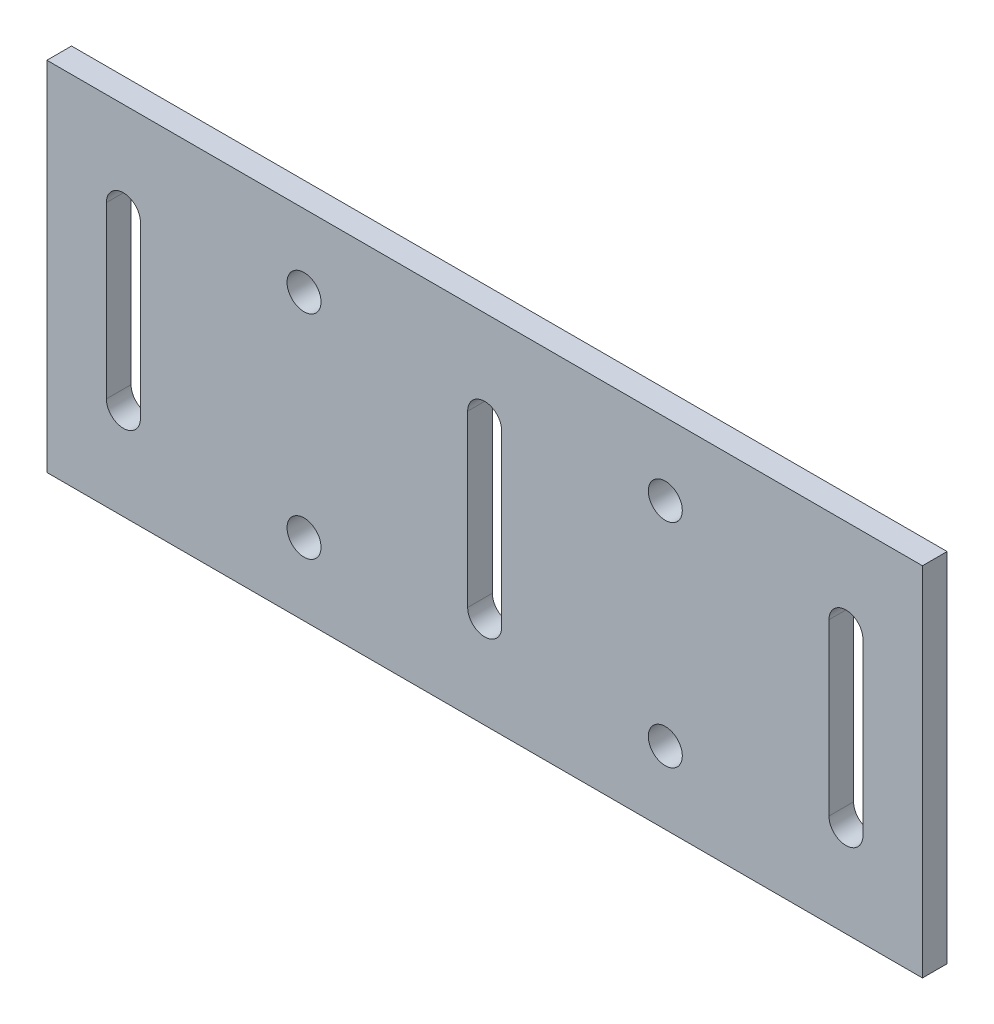
ISO-10303-21;
HEADER;
FILE_DESCRIPTION(('STEP AP214'),'2;1');
FILE_NAME('part.step','',(''),(''),'','','');
FILE_SCHEMA(('AUTOMOTIVE_DESIGN { 1 0 10303 214 1 1 1 1 }'));
ENDSEC;
DATA;
#1=APPLICATION_CONTEXT('core data for automotive mechanical design processes');
#2=APPLICATION_PROTOCOL_DEFINITION('international standard','automotive_design',2000,#1);
#3=PRODUCT_CONTEXT('',#1,'mechanical');
#4=PRODUCT('Part','Part','',(#3));
#5=PRODUCT_RELATED_PRODUCT_CATEGORY('part','',(#4));
#6=PRODUCT_DEFINITION_FORMATION('','',#4);
#7=PRODUCT_DEFINITION_CONTEXT('part definition',#1,'design');
#8=PRODUCT_DEFINITION('design','',#6,#7);
#9=PRODUCT_DEFINITION_SHAPE('','',#8);
#10=(LENGTH_UNIT() NAMED_UNIT(*) SI_UNIT(.MILLI.,.METRE.));
#11=(NAMED_UNIT(*) PLANE_ANGLE_UNIT() SI_UNIT($,.RADIAN.));
#12=(NAMED_UNIT(*) SI_UNIT($,.STERADIAN.) SOLID_ANGLE_UNIT());
#13=UNCERTAINTY_MEASURE_WITH_UNIT(LENGTH_MEASURE(1.E-05),#10,'distance_accuracy_value','');
#14=(GEOMETRIC_REPRESENTATION_CONTEXT(3) GLOBAL_UNCERTAINTY_ASSIGNED_CONTEXT((#13)) GLOBAL_UNIT_ASSIGNED_CONTEXT((#10,
#11,#12)) REPRESENTATION_CONTEXT('',''));
#15=CARTESIAN_POINT('',(0.,0.,0.));
#16=DIRECTION('',(0.,0.,1.));
#17=DIRECTION('',(1.,0.,0.));
#18=AXIS2_PLACEMENT_3D('',#15,#16,#17);
#19=CARTESIAN_POINT('',(0.,0.,5.8));
#20=DIRECTION('',(0.,0.,-1.));
#21=DIRECTION('',(-1.,0.,0.));
#22=AXIS2_PLACEMENT_3D('',#19,#20,#21);
#23=PLANE('',#22);
#24=CARTESIAN_POINT('',(60.5,17.,5.8));
#25=DIRECTION('',(0.,0.,1.));
#26=DIRECTION('',(1.,0.,0.));
#27=AXIS2_PLACEMENT_3D('',#24,#25,#26);
#28=CIRCLE('',#27,4.00000000000001);
#29=CARTESIAN_POINT('',(64.5,17.,5.8));
#30=VERTEX_POINT('',#29);
#31=EDGE_CURVE('E394',#30,#30,#28,.T.);
#32=ORIENTED_EDGE('',*,*,#31,.F.);
#33=EDGE_LOOP('',(#32));
#34=FACE_BOUND('',#33,.T.);
#35=CARTESIAN_POINT('',(145.5,17.,5.8));
#36=DIRECTION('',(0.,0.,1.));
#37=DIRECTION('',(1.,0.,0.));
#38=AXIS2_PLACEMENT_3D('',#35,#36,#37);
#39=CIRCLE('',#38,3.99999999999999);
#40=CARTESIAN_POINT('',(149.5,17.,5.8));
#41=VERTEX_POINT('',#40);
#42=EDGE_CURVE('E398',#41,#41,#39,.T.);
#43=ORIENTED_EDGE('',*,*,#42,.F.);
#44=EDGE_LOOP('',(#43));
#45=FACE_BOUND('',#44,.T.);
#46=CARTESIAN_POINT('',(145.5,67.,5.8));
#47=DIRECTION('',(0.,0.,1.));
#48=DIRECTION('',(1.,0.,0.));
#49=AXIS2_PLACEMENT_3D('',#46,#47,#48);
#50=CIRCLE('',#49,3.99999999999999);
#51=CARTESIAN_POINT('',(149.5,67.,5.8));
#52=VERTEX_POINT('',#51);
#53=EDGE_CURVE('E406',#52,#52,#50,.T.);
#54=ORIENTED_EDGE('',*,*,#53,.F.);
#55=EDGE_LOOP('',(#54));
#56=FACE_BOUND('',#55,.T.);
#57=CARTESIAN_POINT('',(60.5,67.,5.8));
#58=DIRECTION('',(0.,0.,1.));
#59=DIRECTION('',(1.,0.,0.));
#60=AXIS2_PLACEMENT_3D('',#57,#58,#59);
#61=CIRCLE('',#60,4.00000000000001);
#62=CARTESIAN_POINT('',(64.5,67.,5.8));
#63=VERTEX_POINT('',#62);
#64=EDGE_CURVE('E176',#63,#63,#61,.T.);
#65=ORIENTED_EDGE('',*,*,#64,.F.);
#66=EDGE_LOOP('',(#65));
#67=FACE_BOUND('',#66,.T.);
#68=CARTESIAN_POINT('',(103.,62.,5.8));
#69=DIRECTION('',(0.,0.,1.));
#70=DIRECTION('',(1.,0.,0.));
#71=AXIS2_PLACEMENT_3D('',#68,#69,#70);
#72=CIRCLE('',#71,3.99999999999996);
#73=CARTESIAN_POINT('',(107.,62.,5.8));
#74=VERTEX_POINT('',#73);
#75=CARTESIAN_POINT('',(99.,62.,5.8));
#76=VERTEX_POINT('',#75);
#77=EDGE_CURVE('E186',#74,#76,#72,.T.);
#78=ORIENTED_EDGE('',*,*,#77,.F.);
#79=DIRECTION('',(0.,1.,0.));
#80=VECTOR('',#79,1.);
#81=CARTESIAN_POINT('',(107.,62.,5.8));
#82=LINE('',#81,#80);
#83=CARTESIAN_POINT('',(107.,22.,5.8));
#84=VERTEX_POINT('',#83);
#85=EDGE_CURVE('E194',#84,#74,#82,.T.);
#86=ORIENTED_EDGE('',*,*,#85,.F.);
#87=CARTESIAN_POINT('',(103.,22.,5.8));
#88=DIRECTION('',(0.,0.,1.));
#89=DIRECTION('',(1.,0.,0.));
#90=AXIS2_PLACEMENT_3D('',#87,#88,#89);
#91=CIRCLE('',#90,3.99999999999996);
#92=CARTESIAN_POINT('',(99.0000000000001,22.,5.8));
#93=VERTEX_POINT('',#92);
#94=EDGE_CURVE('E191',#93,#84,#91,.T.);
#95=ORIENTED_EDGE('',*,*,#94,.F.);
#96=DIRECTION('',(0.,-1.,0.));
#97=VECTOR('',#96,1.);
#98=CARTESIAN_POINT('',(99.,62.,5.8));
#99=LINE('',#98,#97);
#100=EDGE_CURVE('E188',#76,#93,#99,.T.);
#101=ORIENTED_EDGE('',*,*,#100,.F.);
#102=EDGE_LOOP('',(#78,#86,#95,#101));
#103=FACE_BOUND('',#102,.T.);
#104=DIRECTION('',(0.,-1.,0.));
#105=VECTOR('',#104,1.);
#106=CARTESIAN_POINT('',(0.,0.,5.8));
#107=LINE('',#106,#105);
#108=CARTESIAN_POINT('',(0.,84.,5.8));
#109=VERTEX_POINT('',#108);
#110=CARTESIAN_POINT('',(0.,0.,5.8));
#111=VERTEX_POINT('',#110);
#112=EDGE_CURVE('E248',#109,#111,#107,.T.);
#113=ORIENTED_EDGE('',*,*,#112,.T.);
#114=DIRECTION('',(1.,0.,0.));
#115=VECTOR('',#114,1.);
#116=CARTESIAN_POINT('',(0.,0.,5.8));
#117=LINE('',#116,#115);
#118=CARTESIAN_POINT('',(206.,0.,5.8));
#119=VERTEX_POINT('',#118);
#120=EDGE_CURVE('E251',#111,#119,#117,.T.);
#121=ORIENTED_EDGE('',*,*,#120,.T.);
#122=DIRECTION('',(0.,1.,0.));
#123=VECTOR('',#122,1.);
#124=CARTESIAN_POINT('',(206.,0.,5.8));
#125=LINE('',#124,#123);
#126=CARTESIAN_POINT('',(206.,84.,5.8));
#127=VERTEX_POINT('',#126);
#128=EDGE_CURVE('E254',#119,#127,#125,.T.);
#129=ORIENTED_EDGE('',*,*,#128,.T.);
#130=DIRECTION('',(-1.,0.,0.));
#131=VECTOR('',#130,1.);
#132=CARTESIAN_POINT('',(0.,84.,5.8));
#133=LINE('',#132,#131);
#134=EDGE_CURVE('E256',#127,#109,#133,.T.);
#135=ORIENTED_EDGE('',*,*,#134,.T.);
#136=EDGE_LOOP('',(#113,#121,#129,#135));
#137=FACE_BOUND('',#136,.T.);
#138=CARTESIAN_POINT('',(18.,62.,5.8));
#139=DIRECTION('',(0.,0.,1.));
#140=DIRECTION('',(1.,0.,0.));
#141=AXIS2_PLACEMENT_3D('',#138,#139,#140);
#142=CIRCLE('',#141,4.00000000000001);
#143=CARTESIAN_POINT('',(22.,62.,5.8));
#144=VERTEX_POINT('',#143);
#145=CARTESIAN_POINT('',(14.,62.,5.8));
#146=VERTEX_POINT('',#145);
#147=EDGE_CURVE('E217',#144,#146,#142,.T.);
#148=ORIENTED_EDGE('',*,*,#147,.F.);
#149=DIRECTION('',(0.,1.,0.));
#150=VECTOR('',#149,1.);
#151=CARTESIAN_POINT('',(22.,62.,5.8));
#152=LINE('',#151,#150);
#153=CARTESIAN_POINT('',(22.,22.,5.8));
#154=VERTEX_POINT('',#153);
#155=EDGE_CURVE('E225',#154,#144,#152,.T.);
#156=ORIENTED_EDGE('',*,*,#155,.F.);
#157=CARTESIAN_POINT('',(18.,22.,5.8));
#158=DIRECTION('',(0.,0.,1.));
#159=DIRECTION('',(1.,0.,0.));
#160=AXIS2_PLACEMENT_3D('',#157,#158,#159);
#161=CIRCLE('',#160,4.00000000000001);
#162=CARTESIAN_POINT('',(14.,22.,5.8));
#163=VERTEX_POINT('',#162);
#164=EDGE_CURVE('E222',#163,#154,#161,.T.);
#165=ORIENTED_EDGE('',*,*,#164,.F.);
#166=DIRECTION('',(0.,-1.,0.));
#167=VECTOR('',#166,1.);
#168=CARTESIAN_POINT('',(14.,62.,5.8));
#169=LINE('',#168,#167);
#170=EDGE_CURVE('E219',#146,#163,#169,.T.);
#171=ORIENTED_EDGE('',*,*,#170,.F.);
#172=EDGE_LOOP('',(#148,#156,#165,#171));
#173=FACE_BOUND('',#172,.T.);
#174=CARTESIAN_POINT('',(188.,62.,5.8));
#175=DIRECTION('',(0.,0.,1.));
#176=DIRECTION('',(1.,0.,0.));
#177=AXIS2_PLACEMENT_3D('',#174,#175,#176);
#178=CIRCLE('',#177,4.);
#179=CARTESIAN_POINT('',(192.,62.,5.8));
#180=VERTEX_POINT('',#179);
#181=CARTESIAN_POINT('',(184.,62.,5.8));
#182=VERTEX_POINT('',#181);
#183=EDGE_CURVE('E148',#180,#182,#178,.T.);
#184=ORIENTED_EDGE('',*,*,#183,.F.);
#185=DIRECTION('',(0.,1.,0.));
#186=VECTOR('',#185,1.);
#187=CARTESIAN_POINT('',(192.,62.,5.8));
#188=LINE('',#187,#186);
#189=CARTESIAN_POINT('',(192.,22.,5.8));
#190=VERTEX_POINT('',#189);
#191=EDGE_CURVE('E170',#190,#180,#188,.T.);
#192=ORIENTED_EDGE('',*,*,#191,.F.);
#193=CARTESIAN_POINT('',(188.,22.,5.8));
#194=DIRECTION('',(0.,0.,1.));
#195=DIRECTION('',(1.,0.,0.));
#196=AXIS2_PLACEMENT_3D('',#193,#194,#195);
#197=CIRCLE('',#196,4.);
#198=CARTESIAN_POINT('',(184.,22.,5.8));
#199=VERTEX_POINT('',#198);
#200=EDGE_CURVE('E168',#199,#190,#197,.T.);
#201=ORIENTED_EDGE('',*,*,#200,.F.);
#202=DIRECTION('',(0.,-1.,0.));
#203=VECTOR('',#202,1.);
#204=CARTESIAN_POINT('',(184.,62.,5.8));
#205=LINE('',#204,#203);
#206=EDGE_CURVE('E156',#182,#199,#205,.T.);
#207=ORIENTED_EDGE('',*,*,#206,.F.);
#208=EDGE_LOOP('',(#184,#192,#201,#207));
#209=FACE_BOUND('',#208,.T.);
#210=ADVANCED_FACE('F35',(#34,#45,#56,#67,#103,#137,#173,#209),#23,.F.);
#211=CARTESIAN_POINT('',(0.,0.,0.));
#212=DIRECTION('',(0.,0.,-1.));
#213=DIRECTION('',(-1.,0.,0.));
#214=AXIS2_PLACEMENT_3D('',#211,#212,#213);
#215=PLANE('',#214);
#216=CARTESIAN_POINT('',(60.5,17.,0.));
#217=DIRECTION('',(0.,0.,-1.));
#218=DIRECTION('',(-1.,0.,0.));
#219=AXIS2_PLACEMENT_3D('',#216,#217,#218);
#220=CIRCLE('',#219,4.00000000000001);
#221=CARTESIAN_POINT('',(64.5,17.,0.));
#222=VERTEX_POINT('',#221);
#223=EDGE_CURVE('E392',#222,#222,#220,.F.);
#224=ORIENTED_EDGE('',*,*,#223,.T.);
#225=EDGE_LOOP('',(#224));
#226=FACE_BOUND('',#225,.T.);
#227=CARTESIAN_POINT('',(145.5,17.,0.));
#228=DIRECTION('',(0.,0.,-1.));
#229=DIRECTION('',(-1.,0.,0.));
#230=AXIS2_PLACEMENT_3D('',#227,#228,#229);
#231=CIRCLE('',#230,3.99999999999999);
#232=CARTESIAN_POINT('',(149.5,17.,0.));
#233=VERTEX_POINT('',#232);
#234=EDGE_CURVE('E403',#233,#233,#231,.F.);
#235=ORIENTED_EDGE('',*,*,#234,.T.);
#236=EDGE_LOOP('',(#235));
#237=FACE_BOUND('',#236,.T.);
#238=CARTESIAN_POINT('',(145.5,67.,0.));
#239=DIRECTION('',(0.,0.,-1.));
#240=DIRECTION('',(-1.,0.,0.));
#241=AXIS2_PLACEMENT_3D('',#238,#239,#240);
#242=CIRCLE('',#241,3.99999999999999);
#243=CARTESIAN_POINT('',(149.5,67.,0.));
#244=VERTEX_POINT('',#243);
#245=EDGE_CURVE('E409',#244,#244,#242,.F.);
#246=ORIENTED_EDGE('',*,*,#245,.T.);
#247=EDGE_LOOP('',(#246));
#248=FACE_BOUND('',#247,.T.);
#249=CARTESIAN_POINT('',(60.5,67.,0.));
#250=DIRECTION('',(0.,0.,-1.));
#251=DIRECTION('',(-1.,0.,0.));
#252=AXIS2_PLACEMENT_3D('',#249,#250,#251);
#253=CIRCLE('',#252,4.00000000000001);
#254=CARTESIAN_POINT('',(64.5,67.,0.));
#255=VERTEX_POINT('',#254);
#256=EDGE_CURVE('E395',#255,#255,#253,.F.);
#257=ORIENTED_EDGE('',*,*,#256,.T.);
#258=EDGE_LOOP('',(#257));
#259=FACE_BOUND('',#258,.T.);
#260=DIRECTION('',(0.,-1.,0.));
#261=VECTOR('',#260,1.);
#262=CARTESIAN_POINT('',(0.,0.,0.));
#263=LINE('',#262,#261);
#264=CARTESIAN_POINT('',(0.,84.,0.));
#265=VERTEX_POINT('',#264);
#266=CARTESIAN_POINT('',(0.,0.,0.));
#267=VERTEX_POINT('',#266);
#268=EDGE_CURVE('E247',#265,#267,#263,.T.);
#269=ORIENTED_EDGE('',*,*,#268,.F.);
#270=DIRECTION('',(-1.,0.,0.));
#271=VECTOR('',#270,1.);
#272=CARTESIAN_POINT('',(0.,84.,0.));
#273=LINE('',#272,#271);
#274=CARTESIAN_POINT('',(206.,84.,0.));
#275=VERTEX_POINT('',#274);
#276=EDGE_CURVE('E252',#275,#265,#273,.T.);
#277=ORIENTED_EDGE('',*,*,#276,.F.);
#278=DIRECTION('',(0.,1.,0.));
#279=VECTOR('',#278,1.);
#280=CARTESIAN_POINT('',(206.,0.,0.));
#281=LINE('',#280,#279);
#282=CARTESIAN_POINT('',(206.,0.,0.));
#283=VERTEX_POINT('',#282);
#284=EDGE_CURVE('E263',#283,#275,#281,.T.);
#285=ORIENTED_EDGE('',*,*,#284,.F.);
#286=DIRECTION('',(1.,0.,0.));
#287=VECTOR('',#286,1.);
#288=CARTESIAN_POINT('',(0.,0.,0.));
#289=LINE('',#288,#287);
#290=EDGE_CURVE('E261',#267,#283,#289,.T.);
#291=ORIENTED_EDGE('',*,*,#290,.F.);
#292=EDGE_LOOP('',(#269,#277,#285,#291));
#293=FACE_BOUND('',#292,.T.);
#294=DIRECTION('',(0.,1.,0.));
#295=VECTOR('',#294,1.);
#296=CARTESIAN_POINT('',(22.,62.,0.));
#297=LINE('',#296,#295);
#298=CARTESIAN_POINT('',(22.,22.,0.));
#299=VERTEX_POINT('',#298);
#300=CARTESIAN_POINT('',(22.,62.,0.));
#301=VERTEX_POINT('',#300);
#302=EDGE_CURVE('E220',#299,#301,#297,.T.);
#303=ORIENTED_EDGE('',*,*,#302,.T.);
#304=CARTESIAN_POINT('',(18.,62.,0.));
#305=DIRECTION('',(0.,0.,1.));
#306=DIRECTION('',(1.,0.,0.));
#307=AXIS2_PLACEMENT_3D('',#304,#305,#306);
#308=CIRCLE('',#307,4.00000000000001);
#309=CARTESIAN_POINT('',(14.,62.,0.));
#310=VERTEX_POINT('',#309);
#311=EDGE_CURVE('E216',#301,#310,#308,.T.);
#312=ORIENTED_EDGE('',*,*,#311,.T.);
#313=DIRECTION('',(0.,-1.,0.));
#314=VECTOR('',#313,1.);
#315=CARTESIAN_POINT('',(14.,62.,0.));
#316=LINE('',#315,#314);
#317=CARTESIAN_POINT('',(14.,22.,0.));
#318=VERTEX_POINT('',#317);
#319=EDGE_CURVE('E230',#310,#318,#316,.T.);
#320=ORIENTED_EDGE('',*,*,#319,.T.);
#321=CARTESIAN_POINT('',(18.,22.,0.));
#322=DIRECTION('',(0.,0.,1.));
#323=DIRECTION('',(1.,0.,0.));
#324=AXIS2_PLACEMENT_3D('',#321,#322,#323);
#325=CIRCLE('',#324,4.00000000000001);
#326=EDGE_CURVE('E233',#318,#299,#325,.T.);
#327=ORIENTED_EDGE('',*,*,#326,.T.);
#328=EDGE_LOOP('',(#303,#312,#320,#327));
#329=FACE_BOUND('',#328,.T.);
#330=DIRECTION('',(0.,1.,0.));
#331=VECTOR('',#330,1.);
#332=CARTESIAN_POINT('',(107.,62.,0.));
#333=LINE('',#332,#331);
#334=CARTESIAN_POINT('',(107.,22.,0.));
#335=VERTEX_POINT('',#334);
#336=CARTESIAN_POINT('',(107.,62.,0.));
#337=VERTEX_POINT('',#336);
#338=EDGE_CURVE('E189',#335,#337,#333,.T.);
#339=ORIENTED_EDGE('',*,*,#338,.T.);
#340=CARTESIAN_POINT('',(103.,62.,0.));
#341=DIRECTION('',(0.,0.,1.));
#342=DIRECTION('',(1.,0.,0.));
#343=AXIS2_PLACEMENT_3D('',#340,#341,#342);
#344=CIRCLE('',#343,3.99999999999996);
#345=CARTESIAN_POINT('',(99.,62.,0.));
#346=VERTEX_POINT('',#345);
#347=EDGE_CURVE('E164',#337,#346,#344,.T.);
#348=ORIENTED_EDGE('',*,*,#347,.T.);
#349=DIRECTION('',(0.,-1.,0.));
#350=VECTOR('',#349,1.);
#351=CARTESIAN_POINT('',(99.,62.,0.));
#352=LINE('',#351,#350);
#353=CARTESIAN_POINT('',(99.0000000000001,22.,0.));
#354=VERTEX_POINT('',#353);
#355=EDGE_CURVE('E199',#346,#354,#352,.T.);
#356=ORIENTED_EDGE('',*,*,#355,.T.);
#357=CARTESIAN_POINT('',(103.,22.,0.));
#358=DIRECTION('',(0.,0.,1.));
#359=DIRECTION('',(1.,0.,0.));
#360=AXIS2_PLACEMENT_3D('',#357,#358,#359);
#361=CIRCLE('',#360,3.99999999999996);
#362=EDGE_CURVE('E202',#354,#335,#361,.T.);
#363=ORIENTED_EDGE('',*,*,#362,.T.);
#364=EDGE_LOOP('',(#339,#348,#356,#363));
#365=FACE_BOUND('',#364,.T.);
#366=DIRECTION('',(0.,1.,0.));
#367=VECTOR('',#366,1.);
#368=CARTESIAN_POINT('',(192.,62.,0.));
#369=LINE('',#368,#367);
#370=CARTESIAN_POINT('',(192.,22.,0.));
#371=VERTEX_POINT('',#370);
#372=CARTESIAN_POINT('',(192.,62.,0.));
#373=VERTEX_POINT('',#372);
#374=EDGE_CURVE('E157',#371,#373,#369,.T.);
#375=ORIENTED_EDGE('',*,*,#374,.T.);
#376=CARTESIAN_POINT('',(188.,62.,0.));
#377=DIRECTION('',(0.,0.,1.));
#378=DIRECTION('',(1.,0.,0.));
#379=AXIS2_PLACEMENT_3D('',#376,#377,#378);
#380=CIRCLE('',#379,4.);
#381=CARTESIAN_POINT('',(184.,62.,0.));
#382=VERTEX_POINT('',#381);
#383=EDGE_CURVE('E58',#373,#382,#380,.T.);
#384=ORIENTED_EDGE('',*,*,#383,.T.);
#385=DIRECTION('',(0.,-1.,0.));
#386=VECTOR('',#385,1.);
#387=CARTESIAN_POINT('',(184.,62.,0.));
#388=LINE('',#387,#386);
#389=CARTESIAN_POINT('',(184.,22.,0.));
#390=VERTEX_POINT('',#389);
#391=EDGE_CURVE('E163',#382,#390,#388,.T.);
#392=ORIENTED_EDGE('',*,*,#391,.T.);
#393=CARTESIAN_POINT('',(188.,22.,0.));
#394=DIRECTION('',(0.,0.,1.));
#395=DIRECTION('',(1.,0.,0.));
#396=AXIS2_PLACEMENT_3D('',#393,#394,#395);
#397=CIRCLE('',#396,4.);
#398=EDGE_CURVE('E178',#390,#371,#397,.T.);
#399=ORIENTED_EDGE('',*,*,#398,.T.);
#400=EDGE_LOOP('',(#375,#384,#392,#399));
#401=FACE_BOUND('',#400,.T.);
#402=ADVANCED_FACE('F281',(#226,#237,#248,#259,#293,#329,#365,#401),#215,.T.);
#403=CARTESIAN_POINT('',(0.,0.,5.8));
#404=DIRECTION('',(1.,0.,0.));
#405=DIRECTION('',(0.,0.,-1.));
#406=AXIS2_PLACEMENT_3D('',#403,#404,#405);
#407=PLANE('',#406);
#408=ORIENTED_EDGE('',*,*,#268,.T.);
#409=DIRECTION('',(0.,0.,-1.));
#410=VECTOR('',#409,1.);
#411=CARTESIAN_POINT('',(0.,0.,5.8));
#412=LINE('',#411,#410);
#413=EDGE_CURVE('E11',#111,#267,#412,.T.);
#414=ORIENTED_EDGE('',*,*,#413,.F.);
#415=ORIENTED_EDGE('',*,*,#112,.F.);
#416=DIRECTION('',(0.,0.,-1.));
#417=VECTOR('',#416,1.);
#418=CARTESIAN_POINT('',(0.,84.,5.8));
#419=LINE('',#418,#417);
#420=EDGE_CURVE('E258',#109,#265,#419,.T.);
#421=ORIENTED_EDGE('',*,*,#420,.T.);
#422=EDGE_LOOP('',(#408,#414,#415,#421));
#423=FACE_BOUND('',#422,.T.);
#424=ADVANCED_FACE('F37',(#423),#407,.F.);
#425=CARTESIAN_POINT('',(0.,0.,5.8));
#426=DIRECTION('',(0.,1.,0.));
#427=DIRECTION('',(0.,0.,1.));
#428=AXIS2_PLACEMENT_3D('',#425,#426,#427);
#429=PLANE('',#428);
#430=ORIENTED_EDGE('',*,*,#290,.T.);
#431=DIRECTION('',(0.,0.,-1.));
#432=VECTOR('',#431,1.);
#433=CARTESIAN_POINT('',(206.,0.,5.8));
#434=LINE('',#433,#432);
#435=EDGE_CURVE('E43',#119,#283,#434,.T.);
#436=ORIENTED_EDGE('',*,*,#435,.F.);
#437=ORIENTED_EDGE('',*,*,#120,.F.);
#438=ORIENTED_EDGE('',*,*,#413,.T.);
#439=EDGE_LOOP('',(#430,#436,#437,#438));
#440=FACE_BOUND('',#439,.T.);
#441=ADVANCED_FACE('F292',(#440),#429,.F.);
#442=CARTESIAN_POINT('',(206.,0.,5.8));
#443=DIRECTION('',(-1.,0.,0.));
#444=DIRECTION('',(0.,0.,1.));
#445=AXIS2_PLACEMENT_3D('',#442,#443,#444);
#446=PLANE('',#445);
#447=ORIENTED_EDGE('',*,*,#284,.T.);
#448=DIRECTION('',(0.,0.,-1.));
#449=VECTOR('',#448,1.);
#450=CARTESIAN_POINT('',(206.,84.,5.8));
#451=LINE('',#450,#449);
#452=EDGE_CURVE('E268',#127,#275,#451,.T.);
#453=ORIENTED_EDGE('',*,*,#452,.F.);
#454=ORIENTED_EDGE('',*,*,#128,.F.);
#455=ORIENTED_EDGE('',*,*,#435,.T.);
#456=EDGE_LOOP('',(#447,#453,#454,#455));
#457=FACE_BOUND('',#456,.T.);
#458=ADVANCED_FACE('F275',(#457),#446,.F.);
#459=CARTESIAN_POINT('',(0.,84.,5.8));
#460=DIRECTION('',(0.,-1.,0.));
#461=DIRECTION('',(0.,0.,-1.));
#462=AXIS2_PLACEMENT_3D('',#459,#460,#461);
#463=PLANE('',#462);
#464=ORIENTED_EDGE('',*,*,#276,.T.);
#465=ORIENTED_EDGE('',*,*,#420,.F.);
#466=ORIENTED_EDGE('',*,*,#134,.F.);
#467=ORIENTED_EDGE('',*,*,#452,.T.);
#468=EDGE_LOOP('',(#464,#465,#466,#467));
#469=FACE_BOUND('',#468,.T.);
#470=ADVANCED_FACE('F285',(#469),#463,.F.);
#471=CARTESIAN_POINT('',(18.,62.,5.8));
#472=DIRECTION('',(0.,0.,-1.));
#473=DIRECTION('',(-1.,0.,0.));
#474=AXIS2_PLACEMENT_3D('',#471,#472,#473);
#475=CYLINDRICAL_SURFACE('',#474,4.00000000000001);
#476=ORIENTED_EDGE('',*,*,#311,.F.);
#477=DIRECTION('',(0.,0.,-1.));
#478=VECTOR('',#477,1.);
#479=CARTESIAN_POINT('',(22.,62.,5.8));
#480=LINE('',#479,#478);
#481=EDGE_CURVE('E227',#144,#301,#480,.T.);
#482=ORIENTED_EDGE('',*,*,#481,.F.);
#483=ORIENTED_EDGE('',*,*,#147,.T.);
#484=DIRECTION('',(0.,0.,-1.));
#485=VECTOR('',#484,1.);
#486=CARTESIAN_POINT('',(14.,62.,5.8));
#487=LINE('',#486,#485);
#488=EDGE_CURVE('E244',#146,#310,#487,.T.);
#489=ORIENTED_EDGE('',*,*,#488,.T.);
#490=EDGE_LOOP('',(#476,#482,#483,#489));
#491=FACE_BOUND('',#490,.T.);
#492=ADVANCED_FACE('F311',(#491),#475,.F.);
#493=CARTESIAN_POINT('',(14.,62.,5.8));
#494=DIRECTION('',(1.,0.,0.));
#495=DIRECTION('',(0.,0.,-1.));
#496=AXIS2_PLACEMENT_3D('',#493,#494,#495);
#497=PLANE('',#496);
#498=ORIENTED_EDGE('',*,*,#319,.F.);
#499=ORIENTED_EDGE('',*,*,#488,.F.);
#500=ORIENTED_EDGE('',*,*,#170,.T.);
#501=DIRECTION('',(0.,0.,-1.));
#502=VECTOR('',#501,1.);
#503=CARTESIAN_POINT('',(14.,22.,5.8));
#504=LINE('',#503,#502);
#505=EDGE_CURVE('E242',#163,#318,#504,.T.);
#506=ORIENTED_EDGE('',*,*,#505,.T.);
#507=EDGE_LOOP('',(#498,#499,#500,#506));
#508=FACE_BOUND('',#507,.T.);
#509=ADVANCED_FACE('F318',(#508),#497,.T.);
#510=CARTESIAN_POINT('',(18.,22.,5.8));
#511=DIRECTION('',(0.,0.,-1.));
#512=DIRECTION('',(-1.,0.,0.));
#513=AXIS2_PLACEMENT_3D('',#510,#511,#512);
#514=CYLINDRICAL_SURFACE('',#513,4.00000000000001);
#515=ORIENTED_EDGE('',*,*,#326,.F.);
#516=ORIENTED_EDGE('',*,*,#505,.F.);
#517=ORIENTED_EDGE('',*,*,#164,.T.);
#518=DIRECTION('',(0.,0.,-1.));
#519=VECTOR('',#518,1.);
#520=CARTESIAN_POINT('',(22.,22.,5.8));
#521=LINE('',#520,#519);
#522=EDGE_CURVE('E240',#154,#299,#521,.T.);
#523=ORIENTED_EDGE('',*,*,#522,.T.);
#524=EDGE_LOOP('',(#515,#516,#517,#523));
#525=FACE_BOUND('',#524,.T.);
#526=ADVANCED_FACE('F323',(#525),#514,.F.);
#527=CARTESIAN_POINT('',(22.,62.,5.8));
#528=DIRECTION('',(-1.,0.,0.));
#529=DIRECTION('',(0.,0.,1.));
#530=AXIS2_PLACEMENT_3D('',#527,#528,#529);
#531=PLANE('',#530);
#532=ORIENTED_EDGE('',*,*,#302,.F.);
#533=ORIENTED_EDGE('',*,*,#522,.F.);
#534=ORIENTED_EDGE('',*,*,#155,.T.);
#535=ORIENTED_EDGE('',*,*,#481,.T.);
#536=EDGE_LOOP('',(#532,#533,#534,#535));
#537=FACE_BOUND('',#536,.T.);
#538=ADVANCED_FACE('F330',(#537),#531,.T.);
#539=CARTESIAN_POINT('',(103.,62.,5.8));
#540=DIRECTION('',(0.,0.,-1.));
#541=DIRECTION('',(-1.,0.,0.));
#542=AXIS2_PLACEMENT_3D('',#539,#540,#541);
#543=CYLINDRICAL_SURFACE('',#542,3.99999999999996);
#544=ORIENTED_EDGE('',*,*,#347,.F.);
#545=DIRECTION('',(0.,0.,-1.));
#546=VECTOR('',#545,1.);
#547=CARTESIAN_POINT('',(107.,62.,5.8));
#548=LINE('',#547,#546);
#549=EDGE_CURVE('E196',#74,#337,#548,.T.);
#550=ORIENTED_EDGE('',*,*,#549,.F.);
#551=ORIENTED_EDGE('',*,*,#77,.T.);
#552=DIRECTION('',(0.,0.,-1.));
#553=VECTOR('',#552,1.);
#554=CARTESIAN_POINT('',(99.,62.,5.8));
#555=LINE('',#554,#553);
#556=EDGE_CURVE('E213',#76,#346,#555,.T.);
#557=ORIENTED_EDGE('',*,*,#556,.T.);
#558=EDGE_LOOP('',(#544,#550,#551,#557));
#559=FACE_BOUND('',#558,.T.);
#560=ADVANCED_FACE('F343',(#559),#543,.F.);
#561=CARTESIAN_POINT('',(99.,62.,5.8));
#562=DIRECTION('',(1.,0.,0.));
#563=DIRECTION('',(0.,1.,0.));
#564=AXIS2_PLACEMENT_3D('',#561,#562,#563);
#565=PLANE('',#564);
#566=ORIENTED_EDGE('',*,*,#355,.F.);
#567=ORIENTED_EDGE('',*,*,#556,.F.);
#568=ORIENTED_EDGE('',*,*,#100,.T.);
#569=DIRECTION('',(0.,0.,-1.));
#570=VECTOR('',#569,1.);
#571=CARTESIAN_POINT('',(99.0000000000001,22.,5.8));
#572=LINE('',#571,#570);
#573=EDGE_CURVE('E211',#93,#354,#572,.T.);
#574=ORIENTED_EDGE('',*,*,#573,.T.);
#575=EDGE_LOOP('',(#566,#567,#568,#574));
#576=FACE_BOUND('',#575,.T.);
#577=ADVANCED_FACE('F348',(#576),#565,.T.);
#578=CARTESIAN_POINT('',(103.,22.,5.8));
#579=DIRECTION('',(0.,0.,-1.));
#580=DIRECTION('',(-1.,0.,0.));
#581=AXIS2_PLACEMENT_3D('',#578,#579,#580);
#582=CYLINDRICAL_SURFACE('',#581,3.99999999999996);
#583=ORIENTED_EDGE('',*,*,#362,.F.);
#584=ORIENTED_EDGE('',*,*,#573,.F.);
#585=ORIENTED_EDGE('',*,*,#94,.T.);
#586=DIRECTION('',(0.,0.,-1.));
#587=VECTOR('',#586,1.);
#588=CARTESIAN_POINT('',(107.,22.,5.8));
#589=LINE('',#588,#587);
#590=EDGE_CURVE('E209',#84,#335,#589,.T.);
#591=ORIENTED_EDGE('',*,*,#590,.T.);
#592=EDGE_LOOP('',(#583,#584,#585,#591));
#593=FACE_BOUND('',#592,.T.);
#594=ADVANCED_FACE('F352',(#593),#582,.F.);
#595=CARTESIAN_POINT('',(107.,62.,5.8));
#596=DIRECTION('',(-1.,0.,0.));
#597=DIRECTION('',(0.,-1.,0.));
#598=AXIS2_PLACEMENT_3D('',#595,#596,#597);
#599=PLANE('',#598);
#600=ORIENTED_EDGE('',*,*,#338,.F.);
#601=ORIENTED_EDGE('',*,*,#590,.F.);
#602=ORIENTED_EDGE('',*,*,#85,.T.);
#603=ORIENTED_EDGE('',*,*,#549,.T.);
#604=EDGE_LOOP('',(#600,#601,#602,#603));
#605=FACE_BOUND('',#604,.T.);
#606=ADVANCED_FACE('F356',(#605),#599,.T.);
#607=CARTESIAN_POINT('',(188.,62.,5.8));
#608=DIRECTION('',(0.,0.,-1.));
#609=DIRECTION('',(-1.,0.,0.));
#610=AXIS2_PLACEMENT_3D('',#607,#608,#609);
#611=CYLINDRICAL_SURFACE('',#610,4.);
#612=ORIENTED_EDGE('',*,*,#383,.F.);
#613=DIRECTION('',(0.,0.,-1.));
#614=VECTOR('',#613,1.);
#615=CARTESIAN_POINT('',(192.,62.,5.8));
#616=LINE('',#615,#614);
#617=EDGE_CURVE('E152',#180,#373,#616,.T.);
#618=ORIENTED_EDGE('',*,*,#617,.F.);
#619=ORIENTED_EDGE('',*,*,#183,.T.);
#620=DIRECTION('',(0.,0.,-1.));
#621=VECTOR('',#620,1.);
#622=CARTESIAN_POINT('',(184.,62.,5.8));
#623=LINE('',#622,#621);
#624=EDGE_CURVE('E151',#182,#382,#623,.T.);
#625=ORIENTED_EDGE('',*,*,#624,.T.);
#626=EDGE_LOOP('',(#612,#618,#619,#625));
#627=FACE_BOUND('',#626,.T.);
#628=ADVANCED_FACE('F150',(#627),#611,.F.);
#629=CARTESIAN_POINT('',(184.,62.,5.8));
#630=DIRECTION('',(1.,0.,0.));
#631=DIRECTION('',(0.,0.,-1.));
#632=AXIS2_PLACEMENT_3D('',#629,#630,#631);
#633=PLANE('',#632);
#634=ORIENTED_EDGE('',*,*,#391,.F.);
#635=ORIENTED_EDGE('',*,*,#624,.F.);
#636=ORIENTED_EDGE('',*,*,#206,.T.);
#637=DIRECTION('',(0.,0.,-1.));
#638=VECTOR('',#637,1.);
#639=CARTESIAN_POINT('',(184.,22.,5.8));
#640=LINE('',#639,#638);
#641=EDGE_CURVE('E165',#199,#390,#640,.T.);
#642=ORIENTED_EDGE('',*,*,#641,.T.);
#643=EDGE_LOOP('',(#634,#635,#636,#642));
#644=FACE_BOUND('',#643,.T.);
#645=ADVANCED_FACE('F160',(#644),#633,.T.);
#646=CARTESIAN_POINT('',(188.,22.,5.8));
#647=DIRECTION('',(0.,0.,-1.));
#648=DIRECTION('',(-1.,0.,0.));
#649=AXIS2_PLACEMENT_3D('',#646,#647,#648);
#650=CYLINDRICAL_SURFACE('',#649,4.);
#651=ORIENTED_EDGE('',*,*,#398,.F.);
#652=ORIENTED_EDGE('',*,*,#641,.F.);
#653=ORIENTED_EDGE('',*,*,#200,.T.);
#654=DIRECTION('',(0.,0.,-1.));
#655=VECTOR('',#654,1.);
#656=CARTESIAN_POINT('',(192.,22.,5.8));
#657=LINE('',#656,#655);
#658=EDGE_CURVE('E50',#190,#371,#657,.T.);
#659=ORIENTED_EDGE('',*,*,#658,.T.);
#660=EDGE_LOOP('',(#651,#652,#653,#659));
#661=FACE_BOUND('',#660,.T.);
#662=ADVANCED_FACE('F365',(#661),#650,.F.);
#663=CARTESIAN_POINT('',(192.,62.,5.8));
#664=DIRECTION('',(-1.,0.,0.));
#665=DIRECTION('',(0.,0.,1.));
#666=AXIS2_PLACEMENT_3D('',#663,#664,#665);
#667=PLANE('',#666);
#668=ORIENTED_EDGE('',*,*,#374,.F.);
#669=ORIENTED_EDGE('',*,*,#658,.F.);
#670=ORIENTED_EDGE('',*,*,#191,.T.);
#671=ORIENTED_EDGE('',*,*,#617,.T.);
#672=EDGE_LOOP('',(#668,#669,#670,#671));
#673=FACE_BOUND('',#672,.T.);
#674=ADVANCED_FACE('F368',(#673),#667,.T.);
#675=CARTESIAN_POINT('',(60.5,67.,-0.00100000000000013));
#676=DIRECTION('',(0.,0.,1.));
#677=DIRECTION('',(1.,0.,0.));
#678=AXIS2_PLACEMENT_3D('',#675,#676,#677);
#679=CYLINDRICAL_SURFACE('',#678,4.00000000000001);
#680=CARTESIAN_POINT('',(64.5,67.,0.));
#681=CARTESIAN_POINT('',(64.5,67.,0.0604166666666666));
#682=CARTESIAN_POINT('',(64.5,67.,0.120833333333333));
#683=CARTESIAN_POINT('',(64.5,67.,0.241666666666667));
#684=CARTESIAN_POINT('',(64.5,67.,0.302083333333333));
#685=CARTESIAN_POINT('',(64.5,67.,0.422916666666667));
#686=CARTESIAN_POINT('',(64.5,67.,0.483333333333333));
#687=CARTESIAN_POINT('',(64.5,67.,0.604166666666667));
#688=CARTESIAN_POINT('',(64.5,67.,0.664583333333333));
#689=CARTESIAN_POINT('',(64.5,67.,0.785416666666667));
#690=CARTESIAN_POINT('',(64.5,67.,0.845833333333333));
#691=CARTESIAN_POINT('',(64.5,67.,0.966666666666667));
#692=CARTESIAN_POINT('',(64.5,67.,1.02708333333333));
#693=CARTESIAN_POINT('',(64.5,67.,1.14791666666667));
#694=CARTESIAN_POINT('',(64.5,67.,1.20833333333333));
#695=CARTESIAN_POINT('',(64.5,67.,1.32916666666667));
#696=CARTESIAN_POINT('',(64.5,67.,1.38958333333333));
#697=CARTESIAN_POINT('',(64.5,67.,1.51041666666667));
#698=CARTESIAN_POINT('',(64.5,67.,1.57083333333333));
#699=CARTESIAN_POINT('',(64.5,67.,1.69166666666667));
#700=CARTESIAN_POINT('',(64.5,67.,1.75208333333333));
#701=CARTESIAN_POINT('',(64.5,67.,1.87291666666667));
#702=CARTESIAN_POINT('',(64.5,67.,1.93333333333333));
#703=CARTESIAN_POINT('',(64.5,67.,2.05416666666667));
#704=CARTESIAN_POINT('',(64.5,67.,2.11458333333333));
#705=CARTESIAN_POINT('',(64.5,67.,2.23541666666667));
#706=CARTESIAN_POINT('',(64.5,67.,2.29583333333333));
#707=CARTESIAN_POINT('',(64.5,67.,2.41666666666667));
#708=CARTESIAN_POINT('',(64.5,67.,2.47708333333333));
#709=CARTESIAN_POINT('',(64.5,67.,2.59791666666667));
#710=CARTESIAN_POINT('',(64.5,67.,2.65833333333333));
#711=CARTESIAN_POINT('',(64.5,67.,2.77916666666667));
#712=CARTESIAN_POINT('',(64.5,67.,2.83958333333333));
#713=CARTESIAN_POINT('',(64.5,67.,2.96041666666667));
#714=CARTESIAN_POINT('',(64.5,67.,3.02083333333333));
#715=CARTESIAN_POINT('',(64.5,67.,3.14166666666667));
#716=CARTESIAN_POINT('',(64.5,67.,3.20208333333333));
#717=CARTESIAN_POINT('',(64.5,67.,3.32291666666667));
#718=CARTESIAN_POINT('',(64.5,67.,3.38333333333333));
#719=CARTESIAN_POINT('',(64.5,67.,3.50416666666667));
#720=CARTESIAN_POINT('',(64.5,67.,3.56458333333333));
#721=CARTESIAN_POINT('',(64.5,67.,3.68541666666667));
#722=CARTESIAN_POINT('',(64.5,67.,3.74583333333333));
#723=CARTESIAN_POINT('',(64.5,67.,3.86666666666667));
#724=CARTESIAN_POINT('',(64.5,67.,3.92708333333333));
#725=CARTESIAN_POINT('',(64.5,67.,4.04791666666667));
#726=CARTESIAN_POINT('',(64.5,67.,4.10833333333333));
#727=CARTESIAN_POINT('',(64.5,67.,4.22916666666667));
#728=CARTESIAN_POINT('',(64.5,67.,4.28958333333333));
#729=CARTESIAN_POINT('',(64.5,67.,4.41041666666667));
#730=CARTESIAN_POINT('',(64.5,67.,4.47083333333333));
#731=CARTESIAN_POINT('',(64.5,67.,4.59166666666667));
#732=CARTESIAN_POINT('',(64.5,67.,4.65208333333333));
#733=CARTESIAN_POINT('',(64.5,67.,4.77291666666667));
#734=CARTESIAN_POINT('',(64.5,67.,4.83333333333333));
#735=CARTESIAN_POINT('',(64.5,67.,4.95416666666667));
#736=CARTESIAN_POINT('',(64.5,67.,5.01458333333333));
#737=CARTESIAN_POINT('',(64.5,67.,5.13541666666667));
#738=CARTESIAN_POINT('',(64.5,67.,5.19583333333333));
#739=CARTESIAN_POINT('',(64.5,67.,5.31666666666667));
#740=CARTESIAN_POINT('',(64.5,67.,5.37708333333333));
#741=CARTESIAN_POINT('',(64.5,67.,5.49791666666667));
#742=CARTESIAN_POINT('',(64.5,67.,5.55833333333333));
#743=CARTESIAN_POINT('',(64.5,67.,5.67916666666667));
#744=CARTESIAN_POINT('',(64.5,67.,5.73958333333333));
#745=CARTESIAN_POINT('',(64.5,67.,5.8));
#746=B_SPLINE_CURVE_WITH_KNOTS('',3,(#680,#681,#682,#683,#684,#685,#686,#687,#688,#689,#690,
#691,#692,#693,#694,#695,#696,#697,#698,#699,#700,#701,#702,#703,#704,#705,#706,#707,#708,#709,
#710,#711,#712,#713,#714,#715,#716,#717,#718,#719,#720,#721,#722,#723,#724,#725,#726,#727,#728,
#729,#730,#731,#732,#733,#734,#735,#736,#737,#738,#739,#740,#741,#742,#743,#744,#745),
.UNSPECIFIED.,.F.,.F.,(4,2,2,2,2,2,2,2,2,2,2,2,2,2,2,2,2,2,2,2,2,2,2,2,2,2,2,2,2,2,2,2,4),(0.,
0.18125,0.3625,0.54375,0.725,0.90625,1.0875,1.26875,1.45,1.63125,1.8125,1.99375,2.175,2.35625,
2.5375,2.71875,2.9,3.08125,3.2625,3.44375,3.625,3.80625,3.9875,4.16875,4.35,4.53125,4.7125,
4.89375,5.075,5.25625,5.4375,5.61875,5.8),.UNSPECIFIED.);
#747=EDGE_CURVE('BSEAM372',#255,#63,#746,.T.);
#748=ORIENTED_EDGE('',*,*,#256,.F.);
#749=ORIENTED_EDGE('',*,*,#64,.T.);
#750=ORIENTED_EDGE('',*,*,#747,.T.);
#751=ORIENTED_EDGE('',*,*,#747,.F.);
#752=EDGE_LOOP('',(#748,#750,#749,#751));
#753=FACE_BOUND('',#752,.T.);
#754=ADVANCED_FACE('F372',(#753),#679,.F.);
#755=CARTESIAN_POINT('',(145.5,67.,-0.00100000000000013));
#756=DIRECTION('',(0.,0.,1.));
#757=DIRECTION('',(1.,0.,0.));
#758=AXIS2_PLACEMENT_3D('',#755,#756,#757);
#759=CYLINDRICAL_SURFACE('',#758,3.99999999999999);
#760=CARTESIAN_POINT('',(149.5,67.,0.));
#761=CARTESIAN_POINT('',(149.5,67.,0.0604166666666666));
#762=CARTESIAN_POINT('',(149.5,67.,0.120833333333333));
#763=CARTESIAN_POINT('',(149.5,67.,0.241666666666667));
#764=CARTESIAN_POINT('',(149.5,67.,0.302083333333333));
#765=CARTESIAN_POINT('',(149.5,67.,0.422916666666667));
#766=CARTESIAN_POINT('',(149.5,67.,0.483333333333333));
#767=CARTESIAN_POINT('',(149.5,67.,0.604166666666667));
#768=CARTESIAN_POINT('',(149.5,67.,0.664583333333333));
#769=CARTESIAN_POINT('',(149.5,67.,0.785416666666667));
#770=CARTESIAN_POINT('',(149.5,67.,0.845833333333333));
#771=CARTESIAN_POINT('',(149.5,67.,0.966666666666667));
#772=CARTESIAN_POINT('',(149.5,67.,1.02708333333333));
#773=CARTESIAN_POINT('',(149.5,67.,1.14791666666667));
#774=CARTESIAN_POINT('',(149.5,67.,1.20833333333333));
#775=CARTESIAN_POINT('',(149.5,67.,1.32916666666667));
#776=CARTESIAN_POINT('',(149.5,67.,1.38958333333333));
#777=CARTESIAN_POINT('',(149.5,67.,1.51041666666667));
#778=CARTESIAN_POINT('',(149.5,67.,1.57083333333333));
#779=CARTESIAN_POINT('',(149.5,67.,1.69166666666667));
#780=CARTESIAN_POINT('',(149.5,67.,1.75208333333333));
#781=CARTESIAN_POINT('',(149.5,67.,1.87291666666667));
#782=CARTESIAN_POINT('',(149.5,67.,1.93333333333333));
#783=CARTESIAN_POINT('',(149.5,67.,2.05416666666667));
#784=CARTESIAN_POINT('',(149.5,67.,2.11458333333333));
#785=CARTESIAN_POINT('',(149.5,67.,2.23541666666667));
#786=CARTESIAN_POINT('',(149.5,67.,2.29583333333333));
#787=CARTESIAN_POINT('',(149.5,67.,2.41666666666667));
#788=CARTESIAN_POINT('',(149.5,67.,2.47708333333333));
#789=CARTESIAN_POINT('',(149.5,67.,2.59791666666667));
#790=CARTESIAN_POINT('',(149.5,67.,2.65833333333333));
#791=CARTESIAN_POINT('',(149.5,67.,2.77916666666667));
#792=CARTESIAN_POINT('',(149.5,67.,2.83958333333333));
#793=CARTESIAN_POINT('',(149.5,67.,2.96041666666667));
#794=CARTESIAN_POINT('',(149.5,67.,3.02083333333333));
#795=CARTESIAN_POINT('',(149.5,67.,3.14166666666667));
#796=CARTESIAN_POINT('',(149.5,67.,3.20208333333333));
#797=CARTESIAN_POINT('',(149.5,67.,3.32291666666667));
#798=CARTESIAN_POINT('',(149.5,67.,3.38333333333333));
#799=CARTESIAN_POINT('',(149.5,67.,3.50416666666667));
#800=CARTESIAN_POINT('',(149.5,67.,3.56458333333333));
#801=CARTESIAN_POINT('',(149.5,67.,3.68541666666667));
#802=CARTESIAN_POINT('',(149.5,67.,3.74583333333333));
#803=CARTESIAN_POINT('',(149.5,67.,3.86666666666667));
#804=CARTESIAN_POINT('',(149.5,67.,3.92708333333333));
#805=CARTESIAN_POINT('',(149.5,67.,4.04791666666667));
#806=CARTESIAN_POINT('',(149.5,67.,4.10833333333333));
#807=CARTESIAN_POINT('',(149.5,67.,4.22916666666667));
#808=CARTESIAN_POINT('',(149.5,67.,4.28958333333333));
#809=CARTESIAN_POINT('',(149.5,67.,4.41041666666667));
#810=CARTESIAN_POINT('',(149.5,67.,4.47083333333333));
#811=CARTESIAN_POINT('',(149.5,67.,4.59166666666667));
#812=CARTESIAN_POINT('',(149.5,67.,4.65208333333333));
#813=CARTESIAN_POINT('',(149.5,67.,4.77291666666667));
#814=CARTESIAN_POINT('',(149.5,67.,4.83333333333333));
#815=CARTESIAN_POINT('',(149.5,67.,4.95416666666667));
#816=CARTESIAN_POINT('',(149.5,67.,5.01458333333333));
#817=CARTESIAN_POINT('',(149.5,67.,5.13541666666667));
#818=CARTESIAN_POINT('',(149.5,67.,5.19583333333333));
#819=CARTESIAN_POINT('',(149.5,67.,5.31666666666667));
#820=CARTESIAN_POINT('',(149.5,67.,5.37708333333333));
#821=CARTESIAN_POINT('',(149.5,67.,5.49791666666667));
#822=CARTESIAN_POINT('',(149.5,67.,5.55833333333333));
#823=CARTESIAN_POINT('',(149.5,67.,5.67916666666667));
#824=CARTESIAN_POINT('',(149.5,67.,5.73958333333333));
#825=CARTESIAN_POINT('',(149.5,67.,5.8));
#826=B_SPLINE_CURVE_WITH_KNOTS('',3,(#760,#761,#762,#763,#764,#765,#766,#767,#768,#769,#770,
#771,#772,#773,#774,#775,#776,#777,#778,#779,#780,#781,#782,#783,#784,#785,#786,#787,#788,#789,
#790,#791,#792,#793,#794,#795,#796,#797,#798,#799,#800,#801,#802,#803,#804,#805,#806,#807,#808,
#809,#810,#811,#812,#813,#814,#815,#816,#817,#818,#819,#820,#821,#822,#823,#824,#825),
.UNSPECIFIED.,.F.,.F.,(4,2,2,2,2,2,2,2,2,2,2,2,2,2,2,2,2,2,2,2,2,2,2,2,2,2,2,2,2,2,2,2,4),(0.,
0.18125,0.3625,0.54375,0.725,0.90625,1.0875,1.26875,1.45,1.63125,1.8125,1.99375,2.175,2.35625,
2.5375,2.71875,2.9,3.08125,3.2625,3.44375,3.625,3.80625,3.9875,4.16875,4.35,4.53125,4.7125,
4.89375,5.075,5.25625,5.4375,5.61875,5.8),.UNSPECIFIED.);
#827=EDGE_CURVE('BSEAM375',#244,#52,#826,.T.);
#828=ORIENTED_EDGE('',*,*,#245,.F.);
#829=ORIENTED_EDGE('',*,*,#53,.T.);
#830=ORIENTED_EDGE('',*,*,#827,.T.);
#831=ORIENTED_EDGE('',*,*,#827,.F.);
#832=EDGE_LOOP('',(#828,#830,#829,#831));
#833=FACE_BOUND('',#832,.T.);
#834=ADVANCED_FACE('F375',(#833),#759,.F.);
#835=CARTESIAN_POINT('',(145.5,17.,-0.00100000000000013));
#836=DIRECTION('',(0.,0.,1.));
#837=DIRECTION('',(1.,0.,0.));
#838=AXIS2_PLACEMENT_3D('',#835,#836,#837);
#839=CYLINDRICAL_SURFACE('',#838,3.99999999999999);
#840=CARTESIAN_POINT('',(149.5,17.,0.));
#841=CARTESIAN_POINT('',(149.5,17.,0.0604166666666666));
#842=CARTESIAN_POINT('',(149.5,17.,0.120833333333333));
#843=CARTESIAN_POINT('',(149.5,17.,0.241666666666667));
#844=CARTESIAN_POINT('',(149.5,17.,0.302083333333333));
#845=CARTESIAN_POINT('',(149.5,17.,0.422916666666667));
#846=CARTESIAN_POINT('',(149.5,17.,0.483333333333333));
#847=CARTESIAN_POINT('',(149.5,17.,0.604166666666667));
#848=CARTESIAN_POINT('',(149.5,17.,0.664583333333333));
#849=CARTESIAN_POINT('',(149.5,17.,0.785416666666667));
#850=CARTESIAN_POINT('',(149.5,17.,0.845833333333333));
#851=CARTESIAN_POINT('',(149.5,17.,0.966666666666667));
#852=CARTESIAN_POINT('',(149.5,17.,1.02708333333333));
#853=CARTESIAN_POINT('',(149.5,17.,1.14791666666667));
#854=CARTESIAN_POINT('',(149.5,17.,1.20833333333333));
#855=CARTESIAN_POINT('',(149.5,17.,1.32916666666667));
#856=CARTESIAN_POINT('',(149.5,17.,1.38958333333333));
#857=CARTESIAN_POINT('',(149.5,17.,1.51041666666667));
#858=CARTESIAN_POINT('',(149.5,17.,1.57083333333333));
#859=CARTESIAN_POINT('',(149.5,17.,1.69166666666667));
#860=CARTESIAN_POINT('',(149.5,17.,1.75208333333333));
#861=CARTESIAN_POINT('',(149.5,17.,1.87291666666667));
#862=CARTESIAN_POINT('',(149.5,17.,1.93333333333333));
#863=CARTESIAN_POINT('',(149.5,17.,2.05416666666667));
#864=CARTESIAN_POINT('',(149.5,17.,2.11458333333333));
#865=CARTESIAN_POINT('',(149.5,17.,2.23541666666667));
#866=CARTESIAN_POINT('',(149.5,17.,2.29583333333333));
#867=CARTESIAN_POINT('',(149.5,17.,2.41666666666667));
#868=CARTESIAN_POINT('',(149.5,17.,2.47708333333333));
#869=CARTESIAN_POINT('',(149.5,17.,2.59791666666667));
#870=CARTESIAN_POINT('',(149.5,17.,2.65833333333333));
#871=CARTESIAN_POINT('',(149.5,17.,2.77916666666667));
#872=CARTESIAN_POINT('',(149.5,17.,2.83958333333333));
#873=CARTESIAN_POINT('',(149.5,17.,2.96041666666667));
#874=CARTESIAN_POINT('',(149.5,17.,3.02083333333333));
#875=CARTESIAN_POINT('',(149.5,17.,3.14166666666667));
#876=CARTESIAN_POINT('',(149.5,17.,3.20208333333333));
#877=CARTESIAN_POINT('',(149.5,17.,3.32291666666667));
#878=CARTESIAN_POINT('',(149.5,17.,3.38333333333333));
#879=CARTESIAN_POINT('',(149.5,17.,3.50416666666667));
#880=CARTESIAN_POINT('',(149.5,17.,3.56458333333333));
#881=CARTESIAN_POINT('',(149.5,17.,3.68541666666667));
#882=CARTESIAN_POINT('',(149.5,17.,3.74583333333333));
#883=CARTESIAN_POINT('',(149.5,17.,3.86666666666667));
#884=CARTESIAN_POINT('',(149.5,17.,3.92708333333333));
#885=CARTESIAN_POINT('',(149.5,17.,4.04791666666667));
#886=CARTESIAN_POINT('',(149.5,17.,4.10833333333333));
#887=CARTESIAN_POINT('',(149.5,17.,4.22916666666667));
#888=CARTESIAN_POINT('',(149.5,17.,4.28958333333333));
#889=CARTESIAN_POINT('',(149.5,17.,4.41041666666667));
#890=CARTESIAN_POINT('',(149.5,17.,4.47083333333333));
#891=CARTESIAN_POINT('',(149.5,17.,4.59166666666667));
#892=CARTESIAN_POINT('',(149.5,17.,4.65208333333333));
#893=CARTESIAN_POINT('',(149.5,17.,4.77291666666667));
#894=CARTESIAN_POINT('',(149.5,17.,4.83333333333333));
#895=CARTESIAN_POINT('',(149.5,17.,4.95416666666667));
#896=CARTESIAN_POINT('',(149.5,17.,5.01458333333333));
#897=CARTESIAN_POINT('',(149.5,17.,5.13541666666667));
#898=CARTESIAN_POINT('',(149.5,17.,5.19583333333333));
#899=CARTESIAN_POINT('',(149.5,17.,5.31666666666667));
#900=CARTESIAN_POINT('',(149.5,17.,5.37708333333333));
#901=CARTESIAN_POINT('',(149.5,17.,5.49791666666667));
#902=CARTESIAN_POINT('',(149.5,17.,5.55833333333333));
#903=CARTESIAN_POINT('',(149.5,17.,5.67916666666667));
#904=CARTESIAN_POINT('',(149.5,17.,5.73958333333333));
#905=CARTESIAN_POINT('',(149.5,17.,5.8));
#906=B_SPLINE_CURVE_WITH_KNOTS('',3,(#840,#841,#842,#843,#844,#845,#846,#847,#848,#849,#850,
#851,#852,#853,#854,#855,#856,#857,#858,#859,#860,#861,#862,#863,#864,#865,#866,#867,#868,#869,
#870,#871,#872,#873,#874,#875,#876,#877,#878,#879,#880,#881,#882,#883,#884,#885,#886,#887,#888,
#889,#890,#891,#892,#893,#894,#895,#896,#897,#898,#899,#900,#901,#902,#903,#904,#905),
.UNSPECIFIED.,.F.,.F.,(4,2,2,2,2,2,2,2,2,2,2,2,2,2,2,2,2,2,2,2,2,2,2,2,2,2,2,2,2,2,2,2,4),(0.,
0.18125,0.3625,0.54375,0.725,0.90625,1.0875,1.26875,1.45,1.63125,1.8125,1.99375,2.175,2.35625,
2.5375,2.71875,2.9,3.08125,3.2625,3.44375,3.625,3.80625,3.9875,4.16875,4.35,4.53125,4.7125,
4.89375,5.075,5.25625,5.4375,5.61875,5.8),.UNSPECIFIED.);
#907=EDGE_CURVE('BSEAM379',#233,#41,#906,.T.);
#908=ORIENTED_EDGE('',*,*,#234,.F.);
#909=ORIENTED_EDGE('',*,*,#42,.T.);
#910=ORIENTED_EDGE('',*,*,#907,.T.);
#911=ORIENTED_EDGE('',*,*,#907,.F.);
#912=EDGE_LOOP('',(#908,#910,#909,#911));
#913=FACE_BOUND('',#912,.T.);
#914=ADVANCED_FACE('F379',(#913),#839,.F.);
#915=CARTESIAN_POINT('',(60.5,17.,-0.00100000000000013));
#916=DIRECTION('',(0.,0.,1.));
#917=DIRECTION('',(1.,0.,0.));
#918=AXIS2_PLACEMENT_3D('',#915,#916,#917);
#919=CYLINDRICAL_SURFACE('',#918,4.00000000000001);
#920=CARTESIAN_POINT('',(64.5,17.,0.));
#921=CARTESIAN_POINT('',(64.5,17.,0.0604166666666666));
#922=CARTESIAN_POINT('',(64.5,17.,0.120833333333333));
#923=CARTESIAN_POINT('',(64.5,17.,0.241666666666667));
#924=CARTESIAN_POINT('',(64.5,17.,0.302083333333333));
#925=CARTESIAN_POINT('',(64.5,17.,0.422916666666667));
#926=CARTESIAN_POINT('',(64.5,17.,0.483333333333333));
#927=CARTESIAN_POINT('',(64.5,17.,0.604166666666667));
#928=CARTESIAN_POINT('',(64.5,17.,0.664583333333333));
#929=CARTESIAN_POINT('',(64.5,17.,0.785416666666667));
#930=CARTESIAN_POINT('',(64.5,17.,0.845833333333333));
#931=CARTESIAN_POINT('',(64.5,17.,0.966666666666667));
#932=CARTESIAN_POINT('',(64.5,17.,1.02708333333333));
#933=CARTESIAN_POINT('',(64.5,17.,1.14791666666667));
#934=CARTESIAN_POINT('',(64.5,17.,1.20833333333333));
#935=CARTESIAN_POINT('',(64.5,17.,1.32916666666667));
#936=CARTESIAN_POINT('',(64.5,17.,1.38958333333333));
#937=CARTESIAN_POINT('',(64.5,17.,1.51041666666667));
#938=CARTESIAN_POINT('',(64.5,17.,1.57083333333333));
#939=CARTESIAN_POINT('',(64.5,17.,1.69166666666667));
#940=CARTESIAN_POINT('',(64.5,17.,1.75208333333333));
#941=CARTESIAN_POINT('',(64.5,17.,1.87291666666667));
#942=CARTESIAN_POINT('',(64.5,17.,1.93333333333333));
#943=CARTESIAN_POINT('',(64.5,17.,2.05416666666667));
#944=CARTESIAN_POINT('',(64.5,17.,2.11458333333333));
#945=CARTESIAN_POINT('',(64.5,17.,2.23541666666667));
#946=CARTESIAN_POINT('',(64.5,17.,2.29583333333333));
#947=CARTESIAN_POINT('',(64.5,17.,2.41666666666667));
#948=CARTESIAN_POINT('',(64.5,17.,2.47708333333333));
#949=CARTESIAN_POINT('',(64.5,17.,2.59791666666667));
#950=CARTESIAN_POINT('',(64.5,17.,2.65833333333333));
#951=CARTESIAN_POINT('',(64.5,17.,2.77916666666667));
#952=CARTESIAN_POINT('',(64.5,17.,2.83958333333333));
#953=CARTESIAN_POINT('',(64.5,17.,2.96041666666667));
#954=CARTESIAN_POINT('',(64.5,17.,3.02083333333333));
#955=CARTESIAN_POINT('',(64.5,17.,3.14166666666667));
#956=CARTESIAN_POINT('',(64.5,17.,3.20208333333333));
#957=CARTESIAN_POINT('',(64.5,17.,3.32291666666667));
#958=CARTESIAN_POINT('',(64.5,17.,3.38333333333333));
#959=CARTESIAN_POINT('',(64.5,17.,3.50416666666667));
#960=CARTESIAN_POINT('',(64.5,17.,3.56458333333333));
#961=CARTESIAN_POINT('',(64.5,17.,3.68541666666667));
#962=CARTESIAN_POINT('',(64.5,17.,3.74583333333333));
#963=CARTESIAN_POINT('',(64.5,17.,3.86666666666667));
#964=CARTESIAN_POINT('',(64.5,17.,3.92708333333333));
#965=CARTESIAN_POINT('',(64.5,17.,4.04791666666667));
#966=CARTESIAN_POINT('',(64.5,17.,4.10833333333333));
#967=CARTESIAN_POINT('',(64.5,17.,4.22916666666667));
#968=CARTESIAN_POINT('',(64.5,17.,4.28958333333333));
#969=CARTESIAN_POINT('',(64.5,17.,4.41041666666667));
#970=CARTESIAN_POINT('',(64.5,17.,4.47083333333333));
#971=CARTESIAN_POINT('',(64.5,17.,4.59166666666667));
#972=CARTESIAN_POINT('',(64.5,17.,4.65208333333333));
#973=CARTESIAN_POINT('',(64.5,17.,4.77291666666667));
#974=CARTESIAN_POINT('',(64.5,17.,4.83333333333333));
#975=CARTESIAN_POINT('',(64.5,17.,4.95416666666667));
#976=CARTESIAN_POINT('',(64.5,17.,5.01458333333333));
#977=CARTESIAN_POINT('',(64.5,17.,5.13541666666667));
#978=CARTESIAN_POINT('',(64.5,17.,5.19583333333333));
#979=CARTESIAN_POINT('',(64.5,17.,5.31666666666667));
#980=CARTESIAN_POINT('',(64.5,17.,5.37708333333333));
#981=CARTESIAN_POINT('',(64.5,17.,5.49791666666667));
#982=CARTESIAN_POINT('',(64.5,17.,5.55833333333333));
#983=CARTESIAN_POINT('',(64.5,17.,5.67916666666667));
#984=CARTESIAN_POINT('',(64.5,17.,5.73958333333333));
#985=CARTESIAN_POINT('',(64.5,17.,5.8));
#986=B_SPLINE_CURVE_WITH_KNOTS('',3,(#920,#921,#922,#923,#924,#925,#926,#927,#928,#929,#930,
#931,#932,#933,#934,#935,#936,#937,#938,#939,#940,#941,#942,#943,#944,#945,#946,#947,#948,#949,
#950,#951,#952,#953,#954,#955,#956,#957,#958,#959,#960,#961,#962,#963,#964,#965,#966,#967,#968,
#969,#970,#971,#972,#973,#974,#975,#976,#977,#978,#979,#980,#981,#982,#983,#984,#985),
.UNSPECIFIED.,.F.,.F.,(4,2,2,2,2,2,2,2,2,2,2,2,2,2,2,2,2,2,2,2,2,2,2,2,2,2,2,2,2,2,2,2,4),(0.,
0.18125,0.3625,0.54375,0.725,0.90625,1.0875,1.26875,1.45,1.63125,1.8125,1.99375,2.175,2.35625,
2.5375,2.71875,2.9,3.08125,3.2625,3.44375,3.625,3.80625,3.9875,4.16875,4.35,4.53125,4.7125,
4.89375,5.075,5.25625,5.4375,5.61875,5.8),.UNSPECIFIED.);
#987=EDGE_CURVE('BSEAM383',#222,#30,#986,.T.);
#988=ORIENTED_EDGE('',*,*,#223,.F.);
#989=ORIENTED_EDGE('',*,*,#31,.T.);
#990=ORIENTED_EDGE('',*,*,#987,.T.);
#991=ORIENTED_EDGE('',*,*,#987,.F.);
#992=EDGE_LOOP('',(#988,#990,#989,#991));
#993=FACE_BOUND('',#992,.T.);
#994=ADVANCED_FACE('F383',(#993),#919,.F.);
#995=CLOSED_SHELL('',(#210,#402,#424,#441,#458,#470,#492,#509,#526,#538,#560,#577,#594,#606,
#628,#645,#662,#674,#754,#834,#914,#994));
#996=MANIFOLD_SOLID_BREP('B2',#995);
#997=ADVANCED_BREP_SHAPE_REPRESENTATION('',(#18,#996),#14);
#998=SHAPE_DEFINITION_REPRESENTATION(#9,#997);
ENDSEC;
END-ISO-10303-21;
